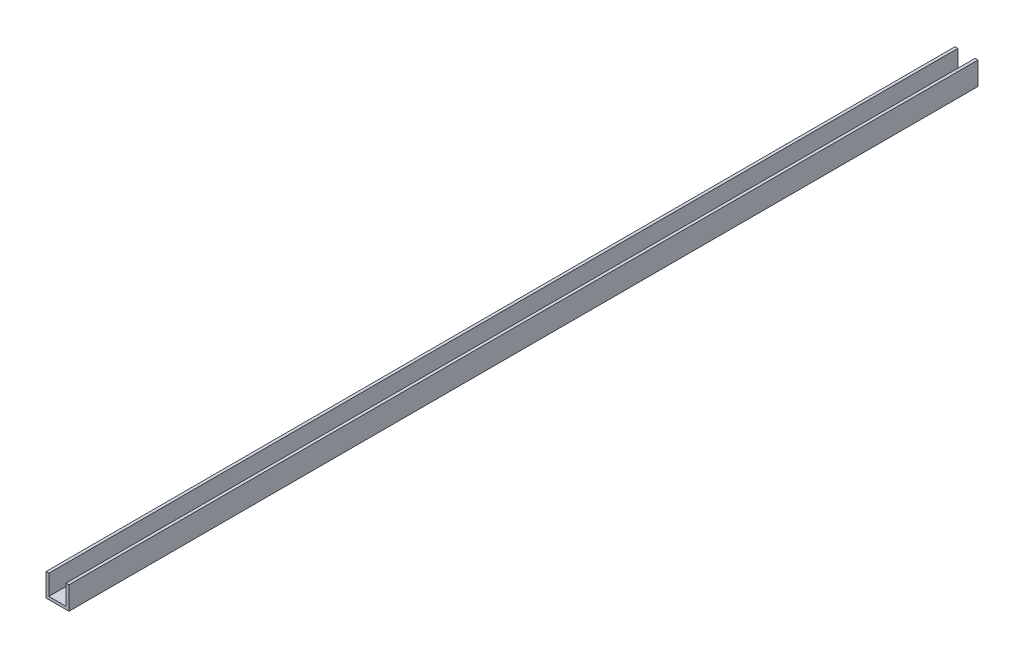
ISO-10303-21;
HEADER;
FILE_DESCRIPTION(('STEP AP214'),'2;1');
FILE_NAME('part.step','',(''),(''),'','','');
FILE_SCHEMA(('AUTOMOTIVE_DESIGN { 1 0 10303 214 1 1 1 1 }'));
ENDSEC;
DATA;
#1=APPLICATION_CONTEXT('core data for automotive mechanical design processes');
#2=APPLICATION_PROTOCOL_DEFINITION('international standard','automotive_design',2000,#1);
#3=PRODUCT_CONTEXT('',#1,'mechanical');
#4=PRODUCT('Part','Part','',(#3));
#5=PRODUCT_RELATED_PRODUCT_CATEGORY('part','',(#4));
#6=PRODUCT_DEFINITION_FORMATION('','',#4);
#7=PRODUCT_DEFINITION_CONTEXT('part definition',#1,'design');
#8=PRODUCT_DEFINITION('design','',#6,#7);
#9=PRODUCT_DEFINITION_SHAPE('','',#8);
#10=(LENGTH_UNIT() NAMED_UNIT(*) SI_UNIT(.MILLI.,.METRE.));
#11=(NAMED_UNIT(*) PLANE_ANGLE_UNIT() SI_UNIT($,.RADIAN.));
#12=(NAMED_UNIT(*) SI_UNIT($,.STERADIAN.) SOLID_ANGLE_UNIT());
#13=UNCERTAINTY_MEASURE_WITH_UNIT(LENGTH_MEASURE(1.E-05),#10,'distance_accuracy_value','');
#14=(GEOMETRIC_REPRESENTATION_CONTEXT(3) GLOBAL_UNCERTAINTY_ASSIGNED_CONTEXT((#13)) GLOBAL_UNIT_ASSIGNED_CONTEXT((#10,
#11,#12)) REPRESENTATION_CONTEXT('',''));
#15=CARTESIAN_POINT('',(0.,0.,0.));
#16=DIRECTION('',(0.,0.,1.));
#17=DIRECTION('',(1.,0.,0.));
#18=AXIS2_PLACEMENT_3D('',#15,#16,#17);
#19=CARTESIAN_POINT('',(0.,0.,475.));
#20=DIRECTION('',(-1.,0.,0.));
#21=DIRECTION('',(0.,-1.,0.));
#22=AXIS2_PLACEMENT_3D('',#19,#20,#21);
#23=PLANE('',#22);
#24=DIRECTION('',(0.,1.,0.));
#25=VECTOR('',#24,1.);
#26=CARTESIAN_POINT('',(0.,0.,0.));
#27=LINE('',#26,#25);
#28=CARTESIAN_POINT('',(0.,0.,0.));
#29=VERTEX_POINT('',#28);
#30=CARTESIAN_POINT('',(0.,12.,0.));
#31=VERTEX_POINT('',#30);
#32=EDGE_CURVE('E129',#29,#31,#27,.T.);
#33=ORIENTED_EDGE('',*,*,#32,.T.);
#34=DIRECTION('',(0.,0.,-1.));
#35=VECTOR('',#34,1.);
#36=CARTESIAN_POINT('',(0.,12.,475.));
#37=LINE('',#36,#35);
#38=CARTESIAN_POINT('',(0.,12.,475.));
#39=VERTEX_POINT('',#38);
#40=EDGE_CURVE('E11',#39,#31,#37,.T.);
#41=ORIENTED_EDGE('',*,*,#40,.F.);
#42=DIRECTION('',(0.,1.,0.));
#43=VECTOR('',#42,1.);
#44=CARTESIAN_POINT('',(0.,0.,475.));
#45=LINE('',#44,#43);
#46=CARTESIAN_POINT('',(0.,0.,475.));
#47=VERTEX_POINT('',#46);
#48=EDGE_CURVE('E143',#47,#39,#45,.T.);
#49=ORIENTED_EDGE('',*,*,#48,.F.);
#50=DIRECTION('',(0.,0.,-1.));
#51=VECTOR('',#50,1.);
#52=CARTESIAN_POINT('',(0.,0.,475.));
#53=LINE('',#52,#51);
#54=EDGE_CURVE('E125',#47,#29,#53,.T.);
#55=ORIENTED_EDGE('',*,*,#54,.T.);
#56=EDGE_LOOP('',(#33,#41,#49,#55));
#57=FACE_BOUND('',#56,.T.);
#58=ADVANCED_FACE('F32',(#57),#23,.F.);
#59=CARTESIAN_POINT('',(0.,12.,475.));
#60=DIRECTION('',(0.,-1.,0.));
#61=DIRECTION('',(0.,0.,-1.));
#62=AXIS2_PLACEMENT_3D('',#59,#60,#61);
#63=PLANE('',#62);
#64=DIRECTION('',(-1.,0.,0.));
#65=VECTOR('',#64,1.);
#66=CARTESIAN_POINT('',(0.,12.,0.));
#67=LINE('',#66,#65);
#68=CARTESIAN_POINT('',(-1.5,12.,0.));
#69=VERTEX_POINT('',#68);
#70=EDGE_CURVE('E132',#31,#69,#67,.T.);
#71=ORIENTED_EDGE('',*,*,#70,.T.);
#72=DIRECTION('',(0.,0.,-1.));
#73=VECTOR('',#72,1.);
#74=CARTESIAN_POINT('',(-1.5,12.,475.));
#75=LINE('',#74,#73);
#76=CARTESIAN_POINT('',(-1.5,12.,475.));
#77=VERTEX_POINT('',#76);
#78=EDGE_CURVE('E41',#77,#69,#75,.T.);
#79=ORIENTED_EDGE('',*,*,#78,.F.);
#80=DIRECTION('',(-1.,0.,0.));
#81=VECTOR('',#80,1.);
#82=CARTESIAN_POINT('',(0.,12.,475.));
#83=LINE('',#82,#81);
#84=EDGE_CURVE('E92',#39,#77,#83,.T.);
#85=ORIENTED_EDGE('',*,*,#84,.F.);
#86=ORIENTED_EDGE('',*,*,#40,.T.);
#87=EDGE_LOOP('',(#71,#79,#85,#86));
#88=FACE_BOUND('',#87,.T.);
#89=ADVANCED_FACE('F195',(#88),#63,.F.);
#90=CARTESIAN_POINT('',(-1.5,12.,475.));
#91=DIRECTION('',(1.,0.,0.));
#92=DIRECTION('',(0.,1.,0.));
#93=AXIS2_PLACEMENT_3D('',#90,#91,#92);
#94=PLANE('',#93);
#95=DIRECTION('',(0.,-1.,0.));
#96=VECTOR('',#95,1.);
#97=CARTESIAN_POINT('',(-1.5,12.,0.));
#98=LINE('',#97,#96);
#99=CARTESIAN_POINT('',(-1.5,1.5,0.));
#100=VERTEX_POINT('',#99);
#101=EDGE_CURVE('E134',#69,#100,#98,.T.);
#102=ORIENTED_EDGE('',*,*,#101,.T.);
#103=DIRECTION('',(0.,0.,-1.));
#104=VECTOR('',#103,1.);
#105=CARTESIAN_POINT('',(-1.5,1.5,475.));
#106=LINE('',#105,#104);
#107=CARTESIAN_POINT('',(-1.5,1.5,475.));
#108=VERTEX_POINT('',#107);
#109=EDGE_CURVE('E150',#108,#100,#106,.T.);
#110=ORIENTED_EDGE('',*,*,#109,.F.);
#111=DIRECTION('',(0.,-1.,0.));
#112=VECTOR('',#111,1.);
#113=CARTESIAN_POINT('',(-1.5,12.,475.));
#114=LINE('',#113,#112);
#115=EDGE_CURVE('E159',#77,#108,#114,.T.);
#116=ORIENTED_EDGE('',*,*,#115,.F.);
#117=ORIENTED_EDGE('',*,*,#78,.T.);
#118=EDGE_LOOP('',(#102,#110,#116,#117));
#119=FACE_BOUND('',#118,.T.);
#120=ADVANCED_FACE('F157',(#119),#94,.F.);
#121=CARTESIAN_POINT('',(-10.5,1.5,475.));
#122=DIRECTION('',(0.,-1.,0.));
#123=DIRECTION('',(0.,0.,-1.));
#124=AXIS2_PLACEMENT_3D('',#121,#122,#123);
#125=PLANE('',#124);
#126=CARTESIAN_POINT('',(-6.,1.5,6.));
#127=DIRECTION('',(0.,1.,0.));
#128=DIRECTION('',(0.,0.,1.));
#129=AXIS2_PLACEMENT_3D('',#126,#127,#128);
#130=CIRCLE('',#129,2.5);
#131=CARTESIAN_POINT('',(-6.,1.5,8.5));
#132=VERTEX_POINT('',#131);
#133=EDGE_CURVE('E177',#132,#132,#130,.T.);
#134=ORIENTED_EDGE('',*,*,#133,.F.);
#135=EDGE_LOOP('',(#134));
#136=FACE_BOUND('',#135,.T.);
#137=DIRECTION('',(-1.,0.,0.));
#138=VECTOR('',#137,1.);
#139=CARTESIAN_POINT('',(-10.5,1.5,0.));
#140=LINE('',#139,#138);
#141=CARTESIAN_POINT('',(-10.5,1.5,0.));
#142=VERTEX_POINT('',#141);
#143=EDGE_CURVE('E136',#100,#142,#140,.T.);
#144=ORIENTED_EDGE('',*,*,#143,.T.);
#145=DIRECTION('',(0.,0.,-1.));
#146=VECTOR('',#145,1.);
#147=CARTESIAN_POINT('',(-10.5,1.5,475.));
#148=LINE('',#147,#146);
#149=CARTESIAN_POINT('',(-10.5,1.5,475.));
#150=VERTEX_POINT('',#149);
#151=EDGE_CURVE('E147',#150,#142,#148,.T.);
#152=ORIENTED_EDGE('',*,*,#151,.F.);
#153=DIRECTION('',(-1.,0.,0.));
#154=VECTOR('',#153,1.);
#155=CARTESIAN_POINT('',(-10.5,1.5,475.));
#156=LINE('',#155,#154);
#157=EDGE_CURVE('E171',#108,#150,#156,.T.);
#158=ORIENTED_EDGE('',*,*,#157,.F.);
#159=ORIENTED_EDGE('',*,*,#109,.T.);
#160=EDGE_LOOP('',(#144,#152,#158,#159));
#161=FACE_BOUND('',#160,.T.);
#162=ADVANCED_FACE('F167',(#136,#161),#125,.F.);
#163=CARTESIAN_POINT('',(-10.5,12.,475.));
#164=DIRECTION('',(-1.,0.,0.));
#165=DIRECTION('',(0.,-1.,0.));
#166=AXIS2_PLACEMENT_3D('',#163,#164,#165);
#167=PLANE('',#166);
#168=DIRECTION('',(0.,1.,0.));
#169=VECTOR('',#168,1.);
#170=CARTESIAN_POINT('',(-10.5,12.,0.));
#171=LINE('',#170,#169);
#172=CARTESIAN_POINT('',(-10.5,12.,0.));
#173=VERTEX_POINT('',#172);
#174=EDGE_CURVE('E138',#142,#173,#171,.T.);
#175=ORIENTED_EDGE('',*,*,#174,.T.);
#176=DIRECTION('',(0.,0.,-1.));
#177=VECTOR('',#176,1.);
#178=CARTESIAN_POINT('',(-10.5,12.,475.));
#179=LINE('',#178,#177);
#180=CARTESIAN_POINT('',(-10.5,12.,475.));
#181=VERTEX_POINT('',#180);
#182=EDGE_CURVE('E120',#181,#173,#179,.T.);
#183=ORIENTED_EDGE('',*,*,#182,.F.);
#184=DIRECTION('',(0.,1.,0.));
#185=VECTOR('',#184,1.);
#186=CARTESIAN_POINT('',(-10.5,12.,475.));
#187=LINE('',#186,#185);
#188=EDGE_CURVE('E111',#150,#181,#187,.T.);
#189=ORIENTED_EDGE('',*,*,#188,.F.);
#190=ORIENTED_EDGE('',*,*,#151,.T.);
#191=EDGE_LOOP('',(#175,#183,#189,#190));
#192=FACE_BOUND('',#191,.T.);
#193=ADVANCED_FACE('F170',(#192),#167,.F.);
#194=CARTESIAN_POINT('',(-10.5,12.,475.));
#195=DIRECTION('',(0.,-1.,0.));
#196=DIRECTION('',(1.,0.,0.));
#197=AXIS2_PLACEMENT_3D('',#194,#195,#196);
#198=PLANE('',#197);
#199=DIRECTION('',(-1.,0.,0.));
#200=VECTOR('',#199,1.);
#201=CARTESIAN_POINT('',(-10.5,12.,0.));
#202=LINE('',#201,#200);
#203=CARTESIAN_POINT('',(-12.,12.,0.));
#204=VERTEX_POINT('',#203);
#205=EDGE_CURVE('E119',#173,#204,#202,.T.);
#206=ORIENTED_EDGE('',*,*,#205,.T.);
#207=DIRECTION('',(0.,0.,-1.));
#208=VECTOR('',#207,1.);
#209=CARTESIAN_POINT('',(-12.,12.,475.));
#210=LINE('',#209,#208);
#211=CARTESIAN_POINT('',(-12.,12.,475.));
#212=VERTEX_POINT('',#211);
#213=EDGE_CURVE('E116',#212,#204,#210,.T.);
#214=ORIENTED_EDGE('',*,*,#213,.F.);
#215=DIRECTION('',(-1.,0.,0.));
#216=VECTOR('',#215,1.);
#217=CARTESIAN_POINT('',(-10.5,12.,475.));
#218=LINE('',#217,#216);
#219=EDGE_CURVE('E105',#181,#212,#218,.T.);
#220=ORIENTED_EDGE('',*,*,#219,.F.);
#221=ORIENTED_EDGE('',*,*,#182,.T.);
#222=EDGE_LOOP('',(#206,#214,#220,#221));
#223=FACE_BOUND('',#222,.T.);
#224=ADVANCED_FACE('F117',(#223),#198,.F.);
#225=CARTESIAN_POINT('',(-12.,0.,475.));
#226=DIRECTION('',(1.,0.,0.));
#227=DIRECTION('',(0.,1.,0.));
#228=AXIS2_PLACEMENT_3D('',#225,#226,#227);
#229=PLANE('',#228);
#230=DIRECTION('',(0.,-1.,0.));
#231=VECTOR('',#230,1.);
#232=CARTESIAN_POINT('',(-12.,0.,0.));
#233=LINE('',#232,#231);
#234=CARTESIAN_POINT('',(-12.,0.,0.));
#235=VERTEX_POINT('',#234);
#236=EDGE_CURVE('E78',#204,#235,#233,.T.);
#237=ORIENTED_EDGE('',*,*,#236,.T.);
#238=DIRECTION('',(0.,0.,-1.));
#239=VECTOR('',#238,1.);
#240=CARTESIAN_POINT('',(-12.,0.,475.));
#241=LINE('',#240,#239);
#242=CARTESIAN_POINT('',(-12.,0.,475.));
#243=VERTEX_POINT('',#242);
#244=EDGE_CURVE('E121',#243,#235,#241,.T.);
#245=ORIENTED_EDGE('',*,*,#244,.F.);
#246=DIRECTION('',(0.,-1.,0.));
#247=VECTOR('',#246,1.);
#248=CARTESIAN_POINT('',(-12.,0.,475.));
#249=LINE('',#248,#247);
#250=EDGE_CURVE('E109',#212,#243,#249,.T.);
#251=ORIENTED_EDGE('',*,*,#250,.F.);
#252=ORIENTED_EDGE('',*,*,#213,.T.);
#253=EDGE_LOOP('',(#237,#245,#251,#252));
#254=FACE_BOUND('',#253,.T.);
#255=ADVANCED_FACE('F123',(#254),#229,.F.);
#256=CARTESIAN_POINT('',(0.,0.,475.));
#257=DIRECTION('',(0.,1.,0.));
#258=DIRECTION('',(-1.,0.,0.));
#259=AXIS2_PLACEMENT_3D('',#256,#257,#258);
#260=PLANE('',#259);
#261=CARTESIAN_POINT('',(-6.,0.,6.));
#262=DIRECTION('',(0.,1.,0.));
#263=DIRECTION('',(-1.,0.,0.));
#264=AXIS2_PLACEMENT_3D('',#261,#262,#263);
#265=CIRCLE('',#264,2.5);
#266=CARTESIAN_POINT('',(-8.5,0.,6.));
#267=VERTEX_POINT('',#266);
#268=EDGE_CURVE('E35',#267,#267,#265,.T.);
#269=ORIENTED_EDGE('',*,*,#268,.T.);
#270=EDGE_LOOP('',(#269));
#271=FACE_BOUND('',#270,.T.);
#272=DIRECTION('',(1.,0.,0.));
#273=VECTOR('',#272,1.);
#274=CARTESIAN_POINT('',(0.,0.,0.));
#275=LINE('',#274,#273);
#276=EDGE_CURVE('E84',#235,#29,#275,.T.);
#277=ORIENTED_EDGE('',*,*,#276,.T.);
#278=ORIENTED_EDGE('',*,*,#54,.F.);
#279=DIRECTION('',(1.,0.,0.));
#280=VECTOR('',#279,1.);
#281=CARTESIAN_POINT('',(0.,0.,475.));
#282=LINE('',#281,#280);
#283=EDGE_CURVE('E49',#243,#47,#282,.T.);
#284=ORIENTED_EDGE('',*,*,#283,.F.);
#285=ORIENTED_EDGE('',*,*,#244,.T.);
#286=EDGE_LOOP('',(#277,#278,#284,#285));
#287=FACE_BOUND('',#286,.T.);
#288=ADVANCED_FACE('F184',(#271,#287),#260,.F.);
#289=CARTESIAN_POINT('',(0.,0.,475.));
#290=DIRECTION('',(0.,0.,1.));
#291=DIRECTION('',(1.,0.,0.));
#292=AXIS2_PLACEMENT_3D('',#289,#290,#291);
#293=PLANE('',#292);
#294=ORIENTED_EDGE('',*,*,#48,.T.);
#295=ORIENTED_EDGE('',*,*,#84,.T.);
#296=ORIENTED_EDGE('',*,*,#115,.T.);
#297=ORIENTED_EDGE('',*,*,#157,.T.);
#298=ORIENTED_EDGE('',*,*,#188,.T.);
#299=ORIENTED_EDGE('',*,*,#219,.T.);
#300=ORIENTED_EDGE('',*,*,#250,.T.);
#301=ORIENTED_EDGE('',*,*,#283,.T.);
#302=EDGE_LOOP('',(#294,#295,#296,#297,#298,#299,#300,#301));
#303=FACE_BOUND('',#302,.T.);
#304=ADVANCED_FACE('F107',(#303),#293,.T.);
#305=CARTESIAN_POINT('',(0.,0.,0.));
#306=DIRECTION('',(0.,0.,1.));
#307=DIRECTION('',(1.,0.,0.));
#308=AXIS2_PLACEMENT_3D('',#305,#306,#307);
#309=PLANE('',#308);
#310=ORIENTED_EDGE('',*,*,#32,.F.);
#311=ORIENTED_EDGE('',*,*,#276,.F.);
#312=ORIENTED_EDGE('',*,*,#236,.F.);
#313=ORIENTED_EDGE('',*,*,#205,.F.);
#314=ORIENTED_EDGE('',*,*,#174,.F.);
#315=ORIENTED_EDGE('',*,*,#143,.F.);
#316=ORIENTED_EDGE('',*,*,#101,.F.);
#317=ORIENTED_EDGE('',*,*,#70,.F.);
#318=EDGE_LOOP('',(#310,#311,#312,#313,#314,#315,#316,#317));
#319=FACE_BOUND('',#318,.T.);
#320=ADVANCED_FACE('F163',(#319),#309,.F.);
#321=CARTESIAN_POINT('',(-6.,-8.5,6.));
#322=DIRECTION('',(0.,1.,0.));
#323=DIRECTION('',(0.,0.,1.));
#324=AXIS2_PLACEMENT_3D('',#321,#322,#323);
#325=CYLINDRICAL_SURFACE('',#324,2.5);
#326=ORIENTED_EDGE('',*,*,#133,.T.);
#327=EDGE_LOOP('',(#326));
#328=FACE_BOUND('',#327,.T.);
#329=ORIENTED_EDGE('',*,*,#268,.F.);
#330=EDGE_LOOP('',(#329));
#331=FACE_BOUND('',#330,.T.);
#332=ADVANCED_FACE('F186',(#328,#331),#325,.F.);
#333=CLOSED_SHELL('',(#58,#89,#120,#162,#193,#224,#255,#288,#304,#320,#332));
#334=MANIFOLD_SOLID_BREP('B2',#333);
#335=ADVANCED_BREP_SHAPE_REPRESENTATION('',(#18,#334),#14);
#336=SHAPE_DEFINITION_REPRESENTATION(#9,#335);
ENDSEC;
END-ISO-10303-21;
